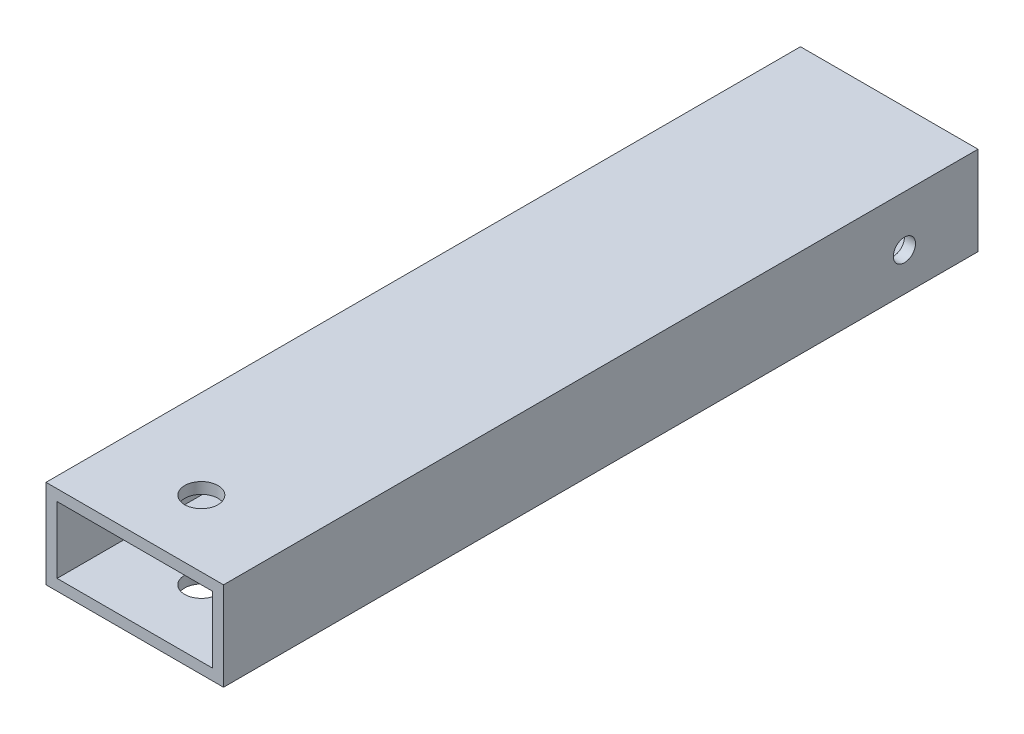
ISO-10303-21;
HEADER;
FILE_DESCRIPTION(('STEP AP214'),'2;1');
FILE_NAME('part.step','',(''),(''),'','','');
FILE_SCHEMA(('AUTOMOTIVE_DESIGN { 1 0 10303 214 1 1 1 1 }'));
ENDSEC;
DATA;
#1=APPLICATION_CONTEXT('core data for automotive mechanical design processes');
#2=APPLICATION_PROTOCOL_DEFINITION('international standard','automotive_design',2000,#1);
#3=PRODUCT_CONTEXT('',#1,'mechanical');
#4=PRODUCT('Part','Part','',(#3));
#5=PRODUCT_RELATED_PRODUCT_CATEGORY('part','',(#4));
#6=PRODUCT_DEFINITION_FORMATION('','',#4);
#7=PRODUCT_DEFINITION_CONTEXT('part definition',#1,'design');
#8=PRODUCT_DEFINITION('design','',#6,#7);
#9=PRODUCT_DEFINITION_SHAPE('','',#8);
#10=(LENGTH_UNIT() NAMED_UNIT(*) SI_UNIT(.MILLI.,.METRE.));
#11=(NAMED_UNIT(*) PLANE_ANGLE_UNIT() SI_UNIT($,.RADIAN.));
#12=(NAMED_UNIT(*) SI_UNIT($,.STERADIAN.) SOLID_ANGLE_UNIT());
#13=UNCERTAINTY_MEASURE_WITH_UNIT(LENGTH_MEASURE(1.E-05),#10,'distance_accuracy_value','');
#14=(GEOMETRIC_REPRESENTATION_CONTEXT(3) GLOBAL_UNCERTAINTY_ASSIGNED_CONTEXT((#13)) GLOBAL_UNIT_ASSIGNED_CONTEXT((#10,
#11,#12)) REPRESENTATION_CONTEXT('',''));
#15=CARTESIAN_POINT('',(0.,0.,0.));
#16=DIRECTION('',(0.,0.,1.));
#17=DIRECTION('',(1.,0.,0.));
#18=AXIS2_PLACEMENT_3D('',#15,#16,#17);
#19=CARTESIAN_POINT('',(25.4,-12.7,304.8));
#20=DIRECTION('',(-1.,0.,0.));
#21=DIRECTION('',(0.,0.,1.));
#22=AXIS2_PLACEMENT_3D('',#19,#20,#21);
#23=PLANE('',#22);
#24=CARTESIAN_POINT('',(25.4,-1.73981744351404,109.947638526116));
#25=DIRECTION('',(-1.,0.,0.));
#26=DIRECTION('',(0.,0.,1.));
#27=AXIS2_PLACEMENT_3D('',#24,#25,#26);
#28=CIRCLE('',#27,3.175);
#29=CARTESIAN_POINT('',(25.4,-1.73981744351404,113.122638526116));
#30=VERTEX_POINT('',#29);
#31=EDGE_CURVE('E127',#30,#30,#28,.T.);
#32=ORIENTED_EDGE('',*,*,#31,.T.);
#33=EDGE_LOOP('',(#32));
#34=FACE_BOUND('',#33,.T.);
#35=DIRECTION('',(0.,-1.,0.));
#36=VECTOR('',#35,1.);
#37=CARTESIAN_POINT('',(25.4,12.7,88.9));
#38=LINE('',#37,#36);
#39=CARTESIAN_POINT('',(25.4,12.7,88.9));
#40=VERTEX_POINT('',#39);
#41=CARTESIAN_POINT('',(25.4,-12.7,88.9000000000001));
#42=VERTEX_POINT('',#41);
#43=EDGE_CURVE('E47',#40,#42,#38,.T.);
#44=ORIENTED_EDGE('',*,*,#43,.F.);
#45=DIRECTION('',(0.,0.,-1.));
#46=VECTOR('',#45,1.);
#47=CARTESIAN_POINT('',(25.4,12.7,304.8));
#48=LINE('',#47,#46);
#49=CARTESIAN_POINT('',(25.4,12.7,304.8));
#50=VERTEX_POINT('',#49);
#51=EDGE_CURVE('E40',#50,#40,#48,.T.);
#52=ORIENTED_EDGE('',*,*,#51,.F.);
#53=DIRECTION('',(0.,1.,0.));
#54=VECTOR('',#53,1.);
#55=CARTESIAN_POINT('',(25.4,-12.7,304.8));
#56=LINE('',#55,#54);
#57=CARTESIAN_POINT('',(25.4,-12.7,304.8));
#58=VERTEX_POINT('',#57);
#59=EDGE_CURVE('E171',#58,#50,#56,.T.);
#60=ORIENTED_EDGE('',*,*,#59,.F.);
#61=DIRECTION('',(0.,0.,-1.));
#62=VECTOR('',#61,1.);
#63=CARTESIAN_POINT('',(25.4,-12.7,304.8));
#64=LINE('',#63,#62);
#65=EDGE_CURVE('E108',#58,#42,#64,.T.);
#66=ORIENTED_EDGE('',*,*,#65,.T.);
#67=EDGE_LOOP('',(#44,#52,#60,#66));
#68=FACE_BOUND('',#67,.T.);
#69=ADVANCED_FACE('F33',(#34,#68),#23,.F.);
#70=CARTESIAN_POINT('',(-25.4,12.7,304.8));
#71=DIRECTION('',(0.,-1.,0.));
#72=DIRECTION('',(0.,0.,-1.));
#73=AXIS2_PLACEMENT_3D('',#70,#71,#72);
#74=PLANE('',#73);
#75=CARTESIAN_POINT('',(0.,12.7,285.75));
#76=DIRECTION('',(0.,1.,0.));
#77=DIRECTION('',(0.,0.,1.));
#78=AXIS2_PLACEMENT_3D('',#75,#76,#77);
#79=CIRCLE('',#78,4.7625);
#80=CARTESIAN_POINT('',(0.,12.7,290.5125));
#81=VERTEX_POINT('',#80);
#82=EDGE_CURVE('E131',#81,#81,#79,.T.);
#83=ORIENTED_EDGE('',*,*,#82,.F.);
#84=EDGE_LOOP('',(#83));
#85=FACE_BOUND('',#84,.T.);
#86=DIRECTION('',(1.,0.,0.));
#87=VECTOR('',#86,1.);
#88=CARTESIAN_POINT('',(-25.4,12.7,88.9));
#89=LINE('',#88,#87);
#90=CARTESIAN_POINT('',(-25.4,12.7,88.9));
#91=VERTEX_POINT('',#90);
#92=EDGE_CURVE('E94',#91,#40,#89,.T.);
#93=ORIENTED_EDGE('',*,*,#92,.F.);
#94=DIRECTION('',(0.,0.,-1.));
#95=VECTOR('',#94,1.);
#96=CARTESIAN_POINT('',(-25.4,12.7,304.8));
#97=LINE('',#96,#95);
#98=CARTESIAN_POINT('',(-25.4,12.7,304.8));
#99=VERTEX_POINT('',#98);
#100=EDGE_CURVE('E114',#99,#91,#97,.T.);
#101=ORIENTED_EDGE('',*,*,#100,.F.);
#102=DIRECTION('',(-1.,0.,0.));
#103=VECTOR('',#102,1.);
#104=CARTESIAN_POINT('',(-25.4,12.7,304.8));
#105=LINE('',#104,#103);
#106=EDGE_CURVE('E112',#50,#99,#105,.T.);
#107=ORIENTED_EDGE('',*,*,#106,.F.);
#108=ORIENTED_EDGE('',*,*,#51,.T.);
#109=EDGE_LOOP('',(#93,#101,#107,#108));
#110=FACE_BOUND('',#109,.T.);
#111=ADVANCED_FACE('F111',(#85,#110),#74,.F.);
#112=CARTESIAN_POINT('',(-25.4,-12.7,304.8));
#113=DIRECTION('',(1.,0.,0.));
#114=DIRECTION('',(0.,0.,-1.));
#115=AXIS2_PLACEMENT_3D('',#112,#113,#114);
#116=PLANE('',#115);
#117=CARTESIAN_POINT('',(-25.4,-1.73981744351404,109.947638526116));
#118=DIRECTION('',(-1.,0.,0.));
#119=DIRECTION('',(0.,0.,1.));
#120=AXIS2_PLACEMENT_3D('',#117,#118,#119);
#121=CIRCLE('',#120,3.175);
#122=CARTESIAN_POINT('',(-25.4,-1.73981744351404,113.122638526116));
#123=VERTEX_POINT('',#122);
#124=EDGE_CURVE('E134',#123,#123,#121,.T.);
#125=ORIENTED_EDGE('',*,*,#124,.F.);
#126=EDGE_LOOP('',(#125));
#127=FACE_BOUND('',#126,.T.);
#128=DIRECTION('',(0.,1.,0.));
#129=VECTOR('',#128,1.);
#130=CARTESIAN_POINT('',(-25.4,-12.7,88.9));
#131=LINE('',#130,#129);
#132=CARTESIAN_POINT('',(-25.4,-12.7,88.9));
#133=VERTEX_POINT('',#132);
#134=EDGE_CURVE('E97',#133,#91,#131,.T.);
#135=ORIENTED_EDGE('',*,*,#134,.F.);
#136=DIRECTION('',(0.,0.,-1.));
#137=VECTOR('',#136,1.);
#138=CARTESIAN_POINT('',(-25.4,-12.7,304.8));
#139=LINE('',#138,#137);
#140=CARTESIAN_POINT('',(-25.4,-12.7,304.8));
#141=VERTEX_POINT('',#140);
#142=EDGE_CURVE('E116',#141,#133,#139,.T.);
#143=ORIENTED_EDGE('',*,*,#142,.F.);
#144=DIRECTION('',(0.,-1.,0.));
#145=VECTOR('',#144,1.);
#146=CARTESIAN_POINT('',(-25.4,-12.7,304.8));
#147=LINE('',#146,#145);
#148=EDGE_CURVE('E174',#99,#141,#147,.T.);
#149=ORIENTED_EDGE('',*,*,#148,.F.);
#150=ORIENTED_EDGE('',*,*,#100,.T.);
#151=EDGE_LOOP('',(#135,#143,#149,#150));
#152=FACE_BOUND('',#151,.T.);
#153=ADVANCED_FACE('F185',(#127,#152),#116,.F.);
#154=CARTESIAN_POINT('',(-25.4,-12.7,304.8));
#155=DIRECTION('',(0.,1.,0.));
#156=DIRECTION('',(-1.,0.,0.));
#157=AXIS2_PLACEMENT_3D('',#154,#155,#156);
#158=PLANE('',#157);
#159=CARTESIAN_POINT('',(0.,-12.7,285.75));
#160=DIRECTION('',(0.,1.,0.));
#161=DIRECTION('',(0.,0.,1.));
#162=AXIS2_PLACEMENT_3D('',#159,#160,#161);
#163=CIRCLE('',#162,4.7625);
#164=CARTESIAN_POINT('',(0.,-12.7,290.5125));
#165=VERTEX_POINT('',#164);
#166=EDGE_CURVE('E123',#165,#165,#163,.T.);
#167=ORIENTED_EDGE('',*,*,#166,.T.);
#168=EDGE_LOOP('',(#167));
#169=FACE_BOUND('',#168,.T.);
#170=DIRECTION('',(-1.,0.,0.));
#171=VECTOR('',#170,1.);
#172=CARTESIAN_POINT('',(25.4,-12.7,88.9));
#173=LINE('',#172,#171);
#174=EDGE_CURVE('E109',#42,#133,#173,.T.);
#175=ORIENTED_EDGE('',*,*,#174,.F.);
#176=ORIENTED_EDGE('',*,*,#65,.F.);
#177=DIRECTION('',(1.,0.,0.));
#178=VECTOR('',#177,1.);
#179=CARTESIAN_POINT('',(-25.4,-12.7,304.8));
#180=LINE('',#179,#178);
#181=EDGE_CURVE('E176',#141,#58,#180,.T.);
#182=ORIENTED_EDGE('',*,*,#181,.F.);
#183=ORIENTED_EDGE('',*,*,#142,.T.);
#184=EDGE_LOOP('',(#175,#176,#182,#183));
#185=FACE_BOUND('',#184,.T.);
#186=ADVANCED_FACE('F182',(#169,#185),#158,.F.);
#187=CARTESIAN_POINT('',(-22.225,-9.525,304.8));
#188=DIRECTION('',(1.,0.,0.));
#189=DIRECTION('',(0.,0.,-1.));
#190=AXIS2_PLACEMENT_3D('',#187,#188,#189);
#191=PLANE('',#190);
#192=CARTESIAN_POINT('',(-22.225,-1.73981744351404,109.947638526116));
#193=DIRECTION('',(1.,0.,0.));
#194=DIRECTION('',(0.,0.,-1.));
#195=AXIS2_PLACEMENT_3D('',#192,#193,#194);
#196=CIRCLE('',#195,3.175);
#197=CARTESIAN_POINT('',(-22.225,-1.73981744351404,106.772638526116));
#198=VERTEX_POINT('',#197);
#199=EDGE_CURVE('E126',#198,#198,#196,.T.);
#200=ORIENTED_EDGE('',*,*,#199,.F.);
#201=EDGE_LOOP('',(#200));
#202=FACE_BOUND('',#201,.T.);
#203=DIRECTION('',(0.,0.,-1.));
#204=VECTOR('',#203,1.);
#205=CARTESIAN_POINT('',(-22.225,-9.525,304.8));
#206=LINE('',#205,#204);
#207=CARTESIAN_POINT('',(-22.225,-9.525,304.8));
#208=VERTEX_POINT('',#207);
#209=CARTESIAN_POINT('',(-22.225,-9.525,88.9));
#210=VERTEX_POINT('',#209);
#211=EDGE_CURVE('E168',#208,#210,#206,.T.);
#212=ORIENTED_EDGE('',*,*,#211,.T.);
#213=DIRECTION('',(0.,1.,0.));
#214=VECTOR('',#213,1.);
#215=CARTESIAN_POINT('',(-22.225,-9.525,88.9));
#216=LINE('',#215,#214);
#217=CARTESIAN_POINT('',(-22.225,9.525,88.9));
#218=VERTEX_POINT('',#217);
#219=EDGE_CURVE('E139',#210,#218,#216,.T.);
#220=ORIENTED_EDGE('',*,*,#219,.T.);
#221=DIRECTION('',(0.,0.,-1.));
#222=VECTOR('',#221,1.);
#223=CARTESIAN_POINT('',(-22.225,9.525,304.8));
#224=LINE('',#223,#222);
#225=CARTESIAN_POINT('',(-22.225,9.525,304.8));
#226=VERTEX_POINT('',#225);
#227=EDGE_CURVE('E159',#226,#218,#224,.T.);
#228=ORIENTED_EDGE('',*,*,#227,.F.);
#229=DIRECTION('',(0.,-1.,0.));
#230=VECTOR('',#229,1.);
#231=CARTESIAN_POINT('',(-22.225,-9.525,304.8));
#232=LINE('',#231,#230);
#233=EDGE_CURVE('E150',#226,#208,#232,.T.);
#234=ORIENTED_EDGE('',*,*,#233,.T.);
#235=EDGE_LOOP('',(#212,#220,#228,#234));
#236=FACE_BOUND('',#235,.T.);
#237=ADVANCED_FACE('F196',(#202,#236),#191,.T.);
#238=CARTESIAN_POINT('',(-22.225,-9.525,304.8));
#239=DIRECTION('',(0.,1.,0.));
#240=DIRECTION('',(0.,0.,1.));
#241=AXIS2_PLACEMENT_3D('',#238,#239,#240);
#242=PLANE('',#241);
#243=CARTESIAN_POINT('',(0.,-9.525,285.75));
#244=DIRECTION('',(0.,1.,0.));
#245=DIRECTION('',(0.,0.,1.));
#246=AXIS2_PLACEMENT_3D('',#243,#244,#245);
#247=CIRCLE('',#246,4.7625);
#248=CARTESIAN_POINT('',(0.,-9.525,290.5125));
#249=VERTEX_POINT('',#248);
#250=EDGE_CURVE('E122',#249,#249,#247,.T.);
#251=ORIENTED_EDGE('',*,*,#250,.F.);
#252=EDGE_LOOP('',(#251));
#253=FACE_BOUND('',#252,.T.);
#254=DIRECTION('',(0.,0.,-1.));
#255=VECTOR('',#254,1.);
#256=CARTESIAN_POINT('',(22.225,-9.525,304.8));
#257=LINE('',#256,#255);
#258=CARTESIAN_POINT('',(22.225,-9.525,304.8));
#259=VERTEX_POINT('',#258);
#260=CARTESIAN_POINT('',(22.225,-9.525,88.9));
#261=VERTEX_POINT('',#260);
#262=EDGE_CURVE('E165',#259,#261,#257,.T.);
#263=ORIENTED_EDGE('',*,*,#262,.T.);
#264=DIRECTION('',(-1.,0.,0.));
#265=VECTOR('',#264,1.);
#266=CARTESIAN_POINT('',(-22.225,-9.525,88.9));
#267=LINE('',#266,#265);
#268=EDGE_CURVE('E187',#261,#210,#267,.T.);
#269=ORIENTED_EDGE('',*,*,#268,.T.);
#270=ORIENTED_EDGE('',*,*,#211,.F.);
#271=DIRECTION('',(1.,0.,0.));
#272=VECTOR('',#271,1.);
#273=CARTESIAN_POINT('',(-22.225,-9.525,304.8));
#274=LINE('',#273,#272);
#275=EDGE_CURVE('E152',#208,#259,#274,.T.);
#276=ORIENTED_EDGE('',*,*,#275,.T.);
#277=EDGE_LOOP('',(#263,#269,#270,#276));
#278=FACE_BOUND('',#277,.T.);
#279=ADVANCED_FACE('F205',(#253,#278),#242,.T.);
#280=CARTESIAN_POINT('',(22.225,-9.525,304.8));
#281=DIRECTION('',(-1.,0.,0.));
#282=DIRECTION('',(0.,-1.,0.));
#283=AXIS2_PLACEMENT_3D('',#280,#281,#282);
#284=PLANE('',#283);
#285=CARTESIAN_POINT('',(22.225,-1.73981744351404,109.947638526116));
#286=DIRECTION('',(-1.,0.,0.));
#287=DIRECTION('',(0.,-1.,0.));
#288=AXIS2_PLACEMENT_3D('',#285,#286,#287);
#289=CIRCLE('',#288,3.175);
#290=CARTESIAN_POINT('',(22.225,-4.91481744351404,109.947638526116));
#291=VERTEX_POINT('',#290);
#292=EDGE_CURVE('E124',#291,#291,#289,.T.);
#293=ORIENTED_EDGE('',*,*,#292,.F.);
#294=EDGE_LOOP('',(#293));
#295=FACE_BOUND('',#294,.T.);
#296=DIRECTION('',(0.,0.,-1.));
#297=VECTOR('',#296,1.);
#298=CARTESIAN_POINT('',(22.225,9.525,304.8));
#299=LINE('',#298,#297);
#300=CARTESIAN_POINT('',(22.225,9.525,304.8));
#301=VERTEX_POINT('',#300);
#302=CARTESIAN_POINT('',(22.225,9.525,88.9000000000001));
#303=VERTEX_POINT('',#302);
#304=EDGE_CURVE('E162',#301,#303,#299,.T.);
#305=ORIENTED_EDGE('',*,*,#304,.T.);
#306=DIRECTION('',(0.,-1.,0.));
#307=VECTOR('',#306,1.);
#308=CARTESIAN_POINT('',(22.225,-9.525,88.9));
#309=LINE('',#308,#307);
#310=EDGE_CURVE('E55',#303,#261,#309,.T.);
#311=ORIENTED_EDGE('',*,*,#310,.T.);
#312=ORIENTED_EDGE('',*,*,#262,.F.);
#313=DIRECTION('',(0.,1.,0.));
#314=VECTOR('',#313,1.);
#315=CARTESIAN_POINT('',(22.225,-9.525,304.8));
#316=LINE('',#315,#314);
#317=EDGE_CURVE('E154',#259,#301,#316,.T.);
#318=ORIENTED_EDGE('',*,*,#317,.T.);
#319=EDGE_LOOP('',(#305,#311,#312,#318));
#320=FACE_BOUND('',#319,.T.);
#321=ADVANCED_FACE('F208',(#295,#320),#284,.T.);
#322=CARTESIAN_POINT('',(-22.225,9.525,304.8));
#323=DIRECTION('',(0.,-1.,0.));
#324=DIRECTION('',(0.,0.,-1.));
#325=AXIS2_PLACEMENT_3D('',#322,#323,#324);
#326=PLANE('',#325);
#327=CARTESIAN_POINT('',(0.,9.525,285.75));
#328=DIRECTION('',(0.,-1.,0.));
#329=DIRECTION('',(0.,0.,-1.));
#330=AXIS2_PLACEMENT_3D('',#327,#328,#329);
#331=CIRCLE('',#330,4.7625);
#332=CARTESIAN_POINT('',(0.,9.525,280.9875));
#333=VERTEX_POINT('',#332);
#334=EDGE_CURVE('E120',#333,#333,#331,.T.);
#335=ORIENTED_EDGE('',*,*,#334,.F.);
#336=EDGE_LOOP('',(#335));
#337=FACE_BOUND('',#336,.T.);
#338=ORIENTED_EDGE('',*,*,#227,.T.);
#339=DIRECTION('',(1.,0.,0.));
#340=VECTOR('',#339,1.);
#341=CARTESIAN_POINT('',(-22.225,9.525,88.9));
#342=LINE('',#341,#340);
#343=EDGE_CURVE('E11',#218,#303,#342,.T.);
#344=ORIENTED_EDGE('',*,*,#343,.T.);
#345=ORIENTED_EDGE('',*,*,#304,.F.);
#346=DIRECTION('',(-1.,0.,0.));
#347=VECTOR('',#346,1.);
#348=CARTESIAN_POINT('',(-22.225,9.525,304.8));
#349=LINE('',#348,#347);
#350=EDGE_CURVE('E157',#301,#226,#349,.T.);
#351=ORIENTED_EDGE('',*,*,#350,.T.);
#352=EDGE_LOOP('',(#338,#344,#345,#351));
#353=FACE_BOUND('',#352,.T.);
#354=ADVANCED_FACE('F199',(#337,#353),#326,.T.);
#355=CARTESIAN_POINT('',(0.,0.,304.8));
#356=DIRECTION('',(0.,0.,-1.));
#357=DIRECTION('',(-1.,0.,0.));
#358=AXIS2_PLACEMENT_3D('',#355,#356,#357);
#359=PLANE('',#358);
#360=ORIENTED_EDGE('',*,*,#59,.T.);
#361=ORIENTED_EDGE('',*,*,#106,.T.);
#362=ORIENTED_EDGE('',*,*,#148,.T.);
#363=ORIENTED_EDGE('',*,*,#181,.T.);
#364=EDGE_LOOP('',(#360,#361,#362,#363));
#365=FACE_BOUND('',#364,.T.);
#366=ORIENTED_EDGE('',*,*,#233,.F.);
#367=ORIENTED_EDGE('',*,*,#350,.F.);
#368=ORIENTED_EDGE('',*,*,#317,.F.);
#369=ORIENTED_EDGE('',*,*,#275,.F.);
#370=EDGE_LOOP('',(#366,#367,#368,#369));
#371=FACE_BOUND('',#370,.T.);
#372=ADVANCED_FACE('F203',(#365,#371),#359,.F.);
#373=CARTESIAN_POINT('',(0.,-12.7,285.75));
#374=DIRECTION('',(0.,1.,0.));
#375=DIRECTION('',(0.,0.,1.));
#376=AXIS2_PLACEMENT_3D('',#373,#374,#375);
#377=CYLINDRICAL_SURFACE('',#376,4.7625);
#378=ORIENTED_EDGE('',*,*,#334,.T.);
#379=EDGE_LOOP('',(#378));
#380=FACE_BOUND('',#379,.T.);
#381=ORIENTED_EDGE('',*,*,#82,.T.);
#382=EDGE_LOOP('',(#381));
#383=FACE_BOUND('',#382,.T.);
#384=ADVANCED_FACE('F238',(#380,#383),#377,.F.);
#385=ORIENTED_EDGE('',*,*,#250,.T.);
#386=EDGE_LOOP('',(#385));
#387=FACE_BOUND('',#386,.T.);
#388=ORIENTED_EDGE('',*,*,#166,.F.);
#389=EDGE_LOOP('',(#388));
#390=FACE_BOUND('',#389,.T.);
#391=ADVANCED_FACE('F257',(#387,#390),#377,.F.);
#392=CARTESIAN_POINT('',(25.4,-1.73981744351404,109.947638526116));
#393=DIRECTION('',(-1.,0.,0.));
#394=DIRECTION('',(0.,0.,1.));
#395=AXIS2_PLACEMENT_3D('',#392,#393,#394);
#396=CYLINDRICAL_SURFACE('',#395,3.175);
#397=ORIENTED_EDGE('',*,*,#292,.T.);
#398=EDGE_LOOP('',(#397));
#399=FACE_BOUND('',#398,.T.);
#400=ORIENTED_EDGE('',*,*,#31,.F.);
#401=EDGE_LOOP('',(#400));
#402=FACE_BOUND('',#401,.T.);
#403=ADVANCED_FACE('F249',(#399,#402),#396,.F.);
#404=ORIENTED_EDGE('',*,*,#199,.T.);
#405=EDGE_LOOP('',(#404));
#406=FACE_BOUND('',#405,.T.);
#407=ORIENTED_EDGE('',*,*,#124,.T.);
#408=EDGE_LOOP('',(#407));
#409=FACE_BOUND('',#408,.T.);
#410=ADVANCED_FACE('F246',(#406,#409),#396,.F.);
#411=CARTESIAN_POINT('',(0.,0.,88.9));
#412=DIRECTION('',(0.,0.,-1.));
#413=DIRECTION('',(-1.,0.,0.));
#414=AXIS2_PLACEMENT_3D('',#411,#412,#413);
#415=PLANE('',#414);
#416=ORIENTED_EDGE('',*,*,#268,.F.);
#417=ORIENTED_EDGE('',*,*,#310,.F.);
#418=ORIENTED_EDGE('',*,*,#343,.F.);
#419=ORIENTED_EDGE('',*,*,#219,.F.);
#420=EDGE_LOOP('',(#416,#417,#418,#419));
#421=FACE_BOUND('',#420,.T.);
#422=ORIENTED_EDGE('',*,*,#92,.T.);
#423=ORIENTED_EDGE('',*,*,#43,.T.);
#424=ORIENTED_EDGE('',*,*,#174,.T.);
#425=ORIENTED_EDGE('',*,*,#134,.T.);
#426=EDGE_LOOP('',(#422,#423,#424,#425));
#427=FACE_BOUND('',#426,.T.);
#428=ADVANCED_FACE('F95',(#421,#427),#415,.T.);
#429=CLOSED_SHELL('',(#69,#111,#153,#186,#237,#279,#321,#354,#372,#384,#391,#403,#410,#428));
#430=MANIFOLD_SOLID_BREP('B2',#429);
#431=ADVANCED_BREP_SHAPE_REPRESENTATION('',(#18,#430),#14);
#432=SHAPE_DEFINITION_REPRESENTATION(#9,#431);
ENDSEC;
END-ISO-10303-21;
